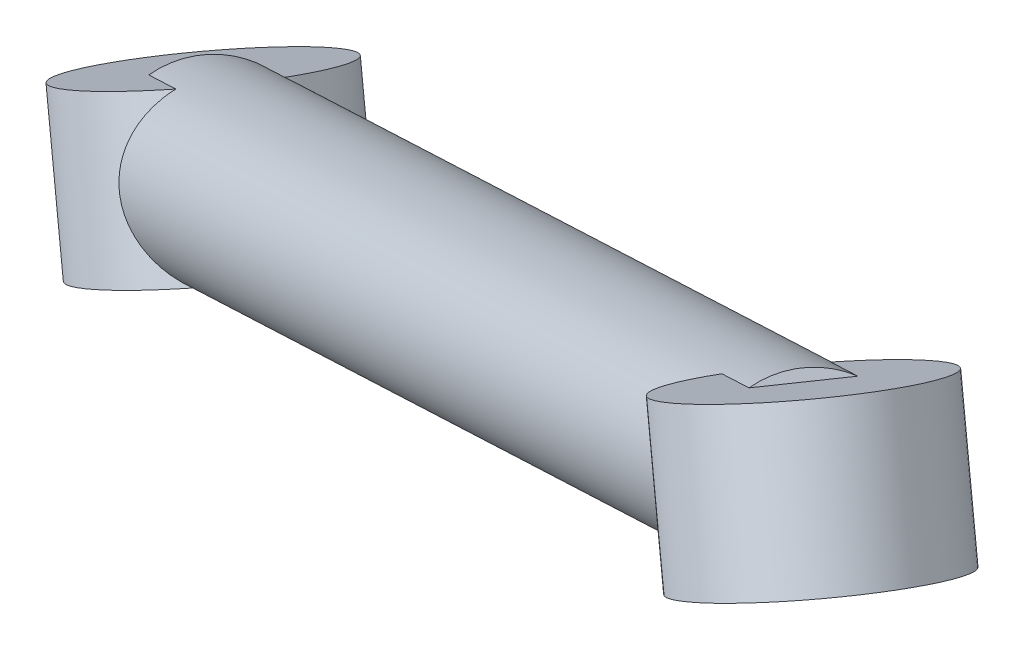
ISO-10303-21;
HEADER;
FILE_DESCRIPTION(('STEP AP214'),'2;1');
FILE_NAME('part.step','',(''),(''),'','','');
FILE_SCHEMA(('AUTOMOTIVE_DESIGN { 1 0 10303 214 1 1 1 1 }'));
ENDSEC;
DATA;
#1=APPLICATION_CONTEXT('core data for automotive mechanical design processes');
#2=APPLICATION_PROTOCOL_DEFINITION('international standard','automotive_design',2000,#1);
#3=PRODUCT_CONTEXT('',#1,'mechanical');
#4=PRODUCT('Part','Part','',(#3));
#5=PRODUCT_RELATED_PRODUCT_CATEGORY('part','',(#4));
#6=PRODUCT_DEFINITION_FORMATION('','',#4);
#7=PRODUCT_DEFINITION_CONTEXT('part definition',#1,'design');
#8=PRODUCT_DEFINITION('design','',#6,#7);
#9=PRODUCT_DEFINITION_SHAPE('','',#8);
#10=(LENGTH_UNIT() NAMED_UNIT(*) SI_UNIT(.MILLI.,.METRE.));
#11=(NAMED_UNIT(*) PLANE_ANGLE_UNIT() SI_UNIT($,.RADIAN.));
#12=(NAMED_UNIT(*) SI_UNIT($,.STERADIAN.) SOLID_ANGLE_UNIT());
#13=UNCERTAINTY_MEASURE_WITH_UNIT(LENGTH_MEASURE(1.E-05),#10,'distance_accuracy_value','');
#14=(GEOMETRIC_REPRESENTATION_CONTEXT(3) GLOBAL_UNCERTAINTY_ASSIGNED_CONTEXT((#13)) GLOBAL_UNIT_ASSIGNED_CONTEXT((#10,
#11,#12)) REPRESENTATION_CONTEXT('',''));
#15=CARTESIAN_POINT('',(0.,0.,0.));
#16=DIRECTION('',(0.,0.,1.));
#17=DIRECTION('',(1.,0.,0.));
#18=AXIS2_PLACEMENT_3D('',#15,#16,#17);
#19=CARTESIAN_POINT('',(-510.46,-91.3399999999999,-282.35));
#20=DIRECTION('',(0.73343010732889,0.486905775206921,0.474344857391413));
#21=DIRECTION('',(-0.553088880485254,0.833122254104143,0.));
#22=AXIS2_PLACEMENT_3D('',#19,#20,#21);
#23=CYLINDRICAL_SURFACE('',#22,8.00000000000003);
#24=CARTESIAN_POINT('',(-503.581405175729,-80.2676399121449,-282.646270580201));
#25=CARTESIAN_POINT('',(-503.476677199646,-80.4115363120821,-282.828175080798));
#26=CARTESIAN_POINT('',(-503.375826094304,-80.5653431792206,-283.004287175508));
#27=CARTESIAN_POINT('',(-503.181173613399,-80.8903905662672,-283.343558039957));
#28=CARTESIAN_POINT('',(-503.087366323826,-81.0616161703276,-283.506727682853));
#29=CARTESIAN_POINT('',(-502.905628953708,-81.4199441120333,-283.819563124503));
#30=CARTESIAN_POINT('',(-502.817718855189,-81.6070959906179,-283.96918355869));
#31=CARTESIAN_POINT('',(-502.646976643849,-81.9948487313955,-284.253192957032));
#32=CARTESIAN_POINT('',(-502.564145664256,-82.1954525741737,-284.387578527694));
#33=CARTESIAN_POINT('',(-502.402486491135,-82.6076796908098,-284.639439078509));
#34=CARTESIAN_POINT('',(-502.323647794297,-82.8192707264558,-284.756960103233));
#35=CARTESIAN_POINT('',(-502.168184001193,-83.2522973519696,-284.974014892292));
#36=CARTESIAN_POINT('',(-502.0915590823,-83.4737337270773,-285.073547218675));
#37=CARTESIAN_POINT('',(-501.93886870445,-83.924399361229,-285.252560766713));
#38=CARTESIAN_POINT('',(-501.862802583783,-84.1536165623884,-285.33207153807));
#39=CARTESIAN_POINT('',(-501.709232500023,-84.6179893751629,-285.46879417626));
#40=CARTESIAN_POINT('',(-501.631729224245,-84.8531421665885,-285.526016428368));
#41=CARTESIAN_POINT('',(-501.444485358783,-85.4127641634102,-285.631377618487));
#42=CARTESIAN_POINT('',(-501.333183173681,-85.7389134685434,-285.668831812061));
#43=CARTESIAN_POINT('',(-501.158109889239,-86.2260052832232,-285.684055610645));
#44=CARTESIAN_POINT('',(-501.098431099207,-86.3879323205382,-285.682315203744));
#45=CARTESIAN_POINT('',(-500.976012490465,-86.7097885562165,-285.664402217226));
#46=CARTESIAN_POINT('',(-500.91327424723,-86.869718730672,-285.64823699305));
#47=CARTESIAN_POINT('',(-500.784106338227,-87.1874278181539,-285.600712115287));
#48=CARTESIAN_POINT('',(-500.717649685585,-87.3451766250713,-285.569223665327));
#49=CARTESIAN_POINT('',(-500.581808686333,-87.6555185564321,-285.490869076787));
#50=CARTESIAN_POINT('',(-500.512424399164,-87.8081117854356,-285.44400325028));
#51=CARTESIAN_POINT('',(-500.371306279346,-88.1067854559784,-285.335263425766));
#52=CARTESIAN_POINT('',(-500.299571644758,-88.252863633583,-285.273384258095));
#53=CARTESIAN_POINT('',(-500.154639559846,-88.5374066150112,-285.135491697386));
#54=CARTESIAN_POINT('',(-500.081442096928,-88.6758713532521,-285.059478182617));
#55=CARTESIAN_POINT('',(-499.941904229745,-88.9312231620048,-284.902724495031));
#56=CARTESIAN_POINT('',(-499.875605451297,-89.0488869711024,-284.823205193333));
#57=CARTESIAN_POINT('',(-499.743397261955,-89.2774486835172,-284.654651254059));
#58=CARTESIAN_POINT('',(-499.677487999901,-89.3883441347021,-284.565613199672));
#59=CARTESIAN_POINT('',(-499.481404952629,-89.7110787760623,-284.285601896247));
#60=CARTESIAN_POINT('',(-499.352903521188,-89.9129168550255,-284.081762634473));
#61=CARTESIAN_POINT('',(-499.132145575385,-90.2515646150561,-283.693414972587));
#62=CARTESIAN_POINT('',(-499.03798112228,-90.3930882124752,-283.513972044894));
#63=CARTESIAN_POINT('',(-498.857931035137,-90.6623913453528,-283.141007828853));
#64=CARTESIAN_POINT('',(-498.772049172752,-90.7901646223523,-282.947480196464));
#65=CARTESIAN_POINT('',(-498.61045307661,-91.0333676777205,-282.548369060755));
#66=CARTESIAN_POINT('',(-498.534754610446,-91.1487782591243,-282.342767553901));
#67=CARTESIAN_POINT('',(-498.39547533516,-91.3681229876227,-281.921611686923));
#68=CARTESIAN_POINT('',(-498.331893390269,-91.4720582099989,-281.706058262017));
#69=CARTESIAN_POINT('',(-498.219643638824,-91.6673871468533,-281.270732507963));
#70=CARTESIAN_POINT('',(-498.170717109407,-91.7589804645991,-281.051116477132));
#71=CARTESIAN_POINT('',(-498.087821722427,-91.9323335654106,-280.605320139953));
#72=CARTESIAN_POINT('',(-498.053849704762,-92.0140954233462,-280.379141231211));
#73=CARTESIAN_POINT('',(-498.002542146742,-92.1678400778827,-279.922230677667));
#74=CARTESIAN_POINT('',(-497.985165172912,-92.239846842198,-279.691511847174));
#75=CARTESIAN_POINT('',(-497.968471548126,-92.3743289341864,-279.226489384899));
#76=CARTESIAN_POINT('',(-497.969168984882,-92.4367967888155,-278.992183099108));
#77=CARTESIAN_POINT('',(-497.979704526284,-92.4944425144162,-278.757022363282));
#78=B_SPLINE_CURVE_WITH_KNOTS('',3,(#24,#25,#26,#27,#28,#29,#30,#31,#32,#33,#34,#35,#36,#37,#38,
#39,#40,#41,#42,#43,#44,#45,#46,#47,#48,#49,#50,#51,#52,#53,#54,#55,#56,#57,#58,#59,#60,#61,#62,
#63,#64,#65,#66,#67,#68,#69,#70,#71,#72,#73,#74,#75,#76,#77),.UNSPECIFIED.,.F.,.F.,(4,2,2,2,2,2,
2,2,2,2,2,2,2,2,2,2,2,2,2,2,2,2,2,2,2,2,4),(0.,0.762982175315845,1.52531641437073,
2.29011533983666,3.05508428723432,3.81792322674232,4.58082311791998,5.34259036141124,
6.10400223574005,7.13950341822891,7.65672989610423,8.17369278275145,8.69507797951773,
9.21645259574195,9.7380069964463,10.259565889148,10.729281816926,11.1991669217808,
12.1391291356849,12.8797876567711,13.6207818754046,14.3629105313426,15.1049695880797,
15.8330299552625,16.5609363990316,17.2870206628004,18.0136708743372),.UNSPECIFIED.);
#79=CARTESIAN_POINT('',(-503.581405175729,-80.2676399121449,-282.646270580201));
#80=VERTEX_POINT('',#79);
#81=CARTESIAN_POINT('',(-497.979704526284,-92.4944425144163,-278.757022363282));
#82=VERTEX_POINT('',#81);
#83=EDGE_CURVE('E234',#80,#82,#78,.T.);
#84=ORIENTED_EDGE('',*,*,#83,.F.);
#85=CARTESIAN_POINT('',(-503.179536162434,-80.0008456001787,-282.386358172645));
#86=CARTESIAN_POINT('',(-504.985091392909,-81.1995243971409,-283.554117296346));
#87=CARTESIAN_POINT('',(-506.790646623384,-82.3982031941031,-284.721876420048));
#88=CARTESIAN_POINT('',(-510.401757084334,-84.7955607880275,-287.057394667451));
#89=CARTESIAN_POINT('',(-512.207312314809,-85.9942395849896,-288.225153791152));
#90=CARTESIAN_POINT('',(-514.012867545284,-87.1929183819518,-289.392912914853));
#91=B_SPLINE_CURVE_WITH_KNOTS('',3,(#85,#86,#87,#88,#89,#90),.UNSPECIFIED.,.F.,.F.,(4,2,4),(0.,
7.38543819120678,14.7708763824135),.UNSPECIFIED.);
#92=CARTESIAN_POINT('',(-511.132478701389,-85.2806750034608,-287.529995461629));
#93=VERTEX_POINT('',#92);
#94=EDGE_CURVE('E145',#80,#93,#91,.T.);
#95=ORIENTED_EDGE('',*,*,#94,.T.);
#96=CARTESIAN_POINT('',(-510.46,-91.3399999999999,-282.35));
#97=DIRECTION('',(0.73343010732889,0.486905775206922,0.474344857391413));
#98=DIRECTION('',(-0.553088880485254,0.833122254104143,0.));
#99=AXIS2_PLACEMENT_3D('',#96,#97,#98);
#100=CIRCLE('',#99,8.00000000000003);
#101=CARTESIAN_POINT('',(-515.389148345821,-85.1725242643061,-281.059364639211));
#102=VERTEX_POINT('',#101);
#103=EDGE_CURVE('E208',#93,#102,#100,.T.);
#104=ORIENTED_EDGE('',*,*,#103,.T.);
#105=CARTESIAN_POINT('',(-515.898318955159,-85.5105509424443,-281.388664567178));
#106=CARTESIAN_POINT('',(-514.481806971051,-84.5701611561515,-280.472552588825));
#107=CARTESIAN_POINT('',(-513.065294986942,-83.6297713698586,-279.556440610471));
#108=CARTESIAN_POINT('',(-510.232271018724,-81.748991797273,-277.724216653763));
#109=CARTESIAN_POINT('',(-508.815759034615,-80.8086020109801,-276.808104675409));
#110=CARTESIAN_POINT('',(-507.399247050507,-79.8682122246873,-275.891992697055));
#111=B_SPLINE_CURVE_WITH_KNOTS('',3,(#105,#106,#107,#108,#109,#110),.UNSPECIFIED.,.F.,.F.,(4,2,
4),(0.,5.794040280628,11.5880805612561),.UNSPECIFIED.);
#112=CARTESIAN_POINT('',(-507.838001217095,-80.1594910430497,-276.175751642969));
#113=VERTEX_POINT('',#112);
#114=EDGE_CURVE('E240',#102,#113,#111,.T.);
#115=ORIENTED_EDGE('',*,*,#114,.T.);
#116=CARTESIAN_POINT('',(-502.23644777212,-92.3862899052442,-272.286279658207));
#117=CARTESIAN_POINT('',(-502.45785165352,-92.3198470600164,-272.179836852182));
#118=CARTESIAN_POINT('',(-502.682597254436,-92.2482861564152,-272.083855335997));
#119=CARTESIAN_POINT('',(-503.136061247345,-92.0950485517274,-271.911974885147));
#120=CARTESIAN_POINT('',(-503.364776103732,-92.0133804922048,-271.836058966302));
#121=CARTESIAN_POINT('',(-503.824594968542,-91.8396553547438,-271.703077333355));
#122=CARTESIAN_POINT('',(-504.055704311868,-91.7475655278904,-271.646073384562));
#123=CARTESIAN_POINT('',(-504.517315142001,-91.5529046519309,-271.550188432395));
#124=CARTESIAN_POINT('',(-504.747816482261,-91.4503312774226,-271.511311460529));
#125=CARTESIAN_POINT('',(-505.20522621156,-91.2344372018308,-271.450733523675));
#126=CARTESIAN_POINT('',(-505.43214281712,-91.1211472176917,-271.428985039942));
#127=CARTESIAN_POINT('',(-505.880658964829,-90.882662423278,-271.40146863843));
#128=CARTESIAN_POINT('',(-506.102258080585,-90.7574666622872,-271.395701997964));
#129=CARTESIAN_POINT('',(-506.537112144204,-90.4941143878635,-271.399185701587));
#130=CARTESIAN_POINT('',(-506.750378996533,-90.3559774007949,-271.408413754164));
#131=CARTESIAN_POINT('',(-507.165528460853,-90.0652528672279,-271.440876746486));
#132=CARTESIAN_POINT('',(-507.367416337994,-89.9126720930391,-271.464105148989));
#133=CARTESIAN_POINT('',(-507.826210313181,-89.5333267657431,-271.534384890679));
#134=CARTESIAN_POINT('',(-508.076763680189,-89.2996283969995,-271.587001663371));
#135=CARTESIAN_POINT('',(-508.421956463312,-88.9254840637553,-271.681817496639));
#136=CARTESIAN_POINT('',(-508.531866548986,-88.7969076332542,-271.716049848365));
#137=CARTESIAN_POINT('',(-508.739985727047,-88.5319528659898,-271.789399160753));
#138=CARTESIAN_POINT('',(-508.8382007538,-88.3955785385259,-271.828513623291));
#139=CARTESIAN_POINT('',(-509.02224203777,-88.1143065634057,-271.911536881457));
#140=CARTESIAN_POINT('',(-509.107955144766,-87.9693459902139,-271.955483822894));
#141=CARTESIAN_POINT('',(-509.264777526166,-87.6729421307664,-272.047416472278));
#142=CARTESIAN_POINT('',(-509.335887096764,-87.5214989760679,-272.095402098283));
#143=CARTESIAN_POINT('',(-509.462834275511,-87.2134271732414,-272.194984333438));
#144=CARTESIAN_POINT('',(-509.518666605979,-87.0567967540143,-272.246582182759));
#145=CARTESIAN_POINT('',(-509.614948705156,-86.7399661538923,-272.353016836927));
#146=CARTESIAN_POINT('',(-509.655398341187,-86.5797659422199,-272.407853669707));
#147=CARTESIAN_POINT('',(-509.718119140487,-86.2734235814709,-272.514931652423));
#148=CARTESIAN_POINT('',(-509.741797418315,-86.1274666007995,-272.56688914376));
#149=CARTESIAN_POINT('',(-509.777730526239,-85.8349934386122,-272.67318310902));
#150=CARTESIAN_POINT('',(-509.789981238872,-85.6884770746225,-272.727520433042));
#151=CARTESIAN_POINT('',(-509.810776819378,-85.249378593867,-272.894173279794));
#152=CARTESIAN_POINT('',(-509.80335360282,-84.9573071608972,-273.010108954459));
#153=CARTESIAN_POINT('',(-509.758262927557,-84.442174282641,-273.226529769961));
#154=CARTESIAN_POINT('',(-509.727341818892,-84.2176111248524,-273.325078860392));
#155=CARTESIAN_POINT('',(-509.6465155583,-83.7751223276322,-273.529332002633));
#156=CARTESIAN_POINT('',(-509.596601808392,-83.5571997427232,-273.635039277115));
#157=CARTESIAN_POINT('',(-509.480341064703,-83.1295389336508,-273.854457615876));
#158=CARTESIAN_POINT('',(-509.413969032091,-82.9198137486595,-273.968180684546));
#159=CARTESIAN_POINT('',(-509.267022146621,-82.5104559903328,-274.204231323387));
#160=CARTESIAN_POINT('',(-509.186448626421,-82.3108224722609,-274.326558085544));
#161=CARTESIAN_POINT('',(-509.014540935373,-81.9268565036553,-274.578114622362));
#162=CARTESIAN_POINT('',(-508.923438605297,-81.7423063523284,-274.707170498541));
#163=CARTESIAN_POINT('',(-508.730777912219,-81.386028195975,-274.974757730262));
#164=CARTESIAN_POINT('',(-508.629221764066,-81.2142974881429,-275.113287076584));
#165=CARTESIAN_POINT('',(-508.417219193927,-80.8857576973748,-275.399908212494));
#166=CARTESIAN_POINT('',(-508.306795657852,-80.7289123455357,-275.547975202337));
#167=CARTESIAN_POINT('',(-508.078016678877,-80.4314772383375,-275.854244228098));
#168=CARTESIAN_POINT('',(-507.959655120081,-80.2909002496656,-276.012454074404));
#169=CARTESIAN_POINT('',(-507.838001217095,-80.1594910430498,-276.175751642968));
#170=B_SPLINE_CURVE_WITH_KNOTS('',3,(#116,#117,#118,#119,#120,#121,#122,#123,#124,#125,#126,
#127,#128,#129,#130,#131,#132,#133,#134,#135,#136,#137,#138,#139,#140,#141,#142,#143,#144,#145,
#146,#147,#148,#149,#150,#151,#152,#153,#154,#155,#156,#157,#158,#159,#160,#161,#162,#163,#164,
#165,#166,#167,#168,#169),.UNSPECIFIED.,.F.,.F.,(4,2,2,2,2,2,2,2,2,2,2,2,2,2,2,2,2,2,2,2,2,2,2,
2,2,2,4),(0.,0.762988254942131,1.52532860832675,2.29013475509881,3.05511091661941,
3.81795729148064,4.58086463341733,5.34263885412005,6.10405765165912,7.13954188038973,
7.65675990399541,8.17371434952899,8.69509046337575,9.21645600145795,9.7380014239373,
10.2595513447314,10.7292678807949,11.1991535950393,12.139117010572,12.8797816748248,
13.6207820381881,14.3629167152052,15.1049817877569,15.8330388812544,16.5609420376944,
17.2870234611222,18.0136708715011),.UNSPECIFIED.);
#171=CARTESIAN_POINT('',(-502.23644777212,-92.3862899052442,-272.286279658207));
#172=VERTEX_POINT('',#171);
#173=EDGE_CURVE('E132',#172,#113,#170,.T.);
#174=ORIENTED_EDGE('',*,*,#173,.F.);
#175=CARTESIAN_POINT('',(-511.186126099011,-98.3278360114482,-278.074564802387));
#176=CARTESIAN_POINT('',(-509.621382400846,-97.2890280803214,-277.062552708586));
#177=CARTESIAN_POINT('',(-508.056638702681,-96.2502201491946,-276.050540614785));
#178=CARTESIAN_POINT('',(-504.927151306351,-94.172604286941,-274.026516427184));
#179=CARTESIAN_POINT('',(-503.362407608186,-93.1337963558141,-273.014504333383));
#180=CARTESIAN_POINT('',(-501.797663910021,-92.0949884246873,-272.002492239582));
#181=B_SPLINE_CURVE_WITH_KNOTS('',3,(#175,#176,#177,#178,#179,#180),.UNSPECIFIED.,.F.,.F.,(4,2,
4),(0.,6.40042335556506,12.8008467111301),.UNSPECIFIED.);
#182=CARTESIAN_POINT('',(-509.787521298611,-97.3993249965391,-277.170004538371));
#183=VERTEX_POINT('',#182);
#184=EDGE_CURVE('E219',#183,#172,#181,.T.);
#185=ORIENTED_EDGE('',*,*,#184,.F.);
#186=CARTESIAN_POINT('',(-505.530851654179,-97.5074757356939,-283.640635360788));
#187=VERTEX_POINT('',#186);
#188=EDGE_CURVE('E210',#183,#187,#100,.T.);
#189=ORIENTED_EDGE('',*,*,#188,.T.);
#190=CARTESIAN_POINT('',(-497.577872162434,-92.2276752331851,-278.497142146136));
#191=CARTESIAN_POINT('',(-499.109320605838,-93.244368696229,-279.487587888538));
#192=CARTESIAN_POINT('',(-500.640769049243,-94.2610621592728,-280.478033630939));
#193=CARTESIAN_POINT('',(-503.703665936053,-96.2944490853606,-282.458925115742));
#194=CARTESIAN_POINT('',(-505.235114379458,-97.3111425484044,-283.449370858143));
#195=CARTESIAN_POINT('',(-506.766562822862,-98.3278360114483,-284.439816600544));
#196=B_SPLINE_CURVE_WITH_KNOTS('',3,(#190,#191,#192,#193,#194,#195),.UNSPECIFIED.,.F.,.F.,(4,2,
4),(0.,6.26417147843164,12.5283429568633),.UNSPECIFIED.);
#197=EDGE_CURVE('E148',#82,#187,#196,.T.);
#198=ORIENTED_EDGE('',*,*,#197,.F.);
#199=EDGE_LOOP('',(#84,#95,#104,#115,#174,#185,#189,#198));
#200=FACE_BOUND('',#199,.T.);
#201=CARTESIAN_POINT('',(-355.536595473716,20.9495425144163,-177.674877636718));
#202=CARTESIAN_POINT('',(-355.5476598468,20.8890060738787,-177.427941773889));
#203=CARTESIAN_POINT('',(-355.54787472409,20.8231608221911,-177.181957310636));
#204=CARTESIAN_POINT('',(-355.528448338031,20.680950967346,-176.694050333385));
#205=CARTESIAN_POINT('',(-355.508823935632,20.6045953443144,-176.452124547504));
#206=CARTESIAN_POINT('',(-355.451481803249,20.4410960781896,-175.973294936523));
#207=CARTESIAN_POINT('',(-355.413705755626,20.3539183400299,-175.736409886011));
#208=CARTESIAN_POINT('',(-355.32191634427,20.1686536500884,-175.270123452795));
#209=CARTESIAN_POINT('',(-355.267899372884,20.07056427752,-175.040723745401));
#210=CARTESIAN_POINT('',(-355.145683765838,19.8631865997485,-174.591767797758));
#211=CARTESIAN_POINT('',(-355.07752503236,19.7539302340592,-174.372185930254));
#212=CARTESIAN_POINT('',(-354.928824003506,19.523062950381,-173.943948629661));
#213=CARTESIAN_POINT('',(-354.848280718866,19.4014510457078,-173.735294071222));
#214=CARTESIAN_POINT('',(-354.676910276592,19.1447931945736,-173.331284749242));
#215=CARTESIAN_POINT('',(-354.586098570937,19.0097674695321,-173.135910692248));
#216=CARTESIAN_POINT('',(-354.396345476108,18.7247696627256,-172.760819115255));
#217=CARTESIAN_POINT('',(-354.297407899792,18.5748045839185,-172.581094332872));
#218=CARTESIAN_POINT('',(-354.057010405438,18.2010081346901,-172.178826647923));
#219=CARTESIAN_POINT('',(-353.913063045027,17.9700183431617,-171.964156399213));
#220=CARTESIAN_POINT('',(-353.695047835092,17.5991052563363,-171.676015926326));
#221=CARTESIAN_POINT('',(-353.622064595143,17.4714670395077,-171.585650492617));
#222=CARTESIAN_POINT('',(-353.476367114584,17.2080982427996,-171.417412971));
#223=CARTESIAN_POINT('',(-353.403652755844,17.0723718199948,-171.339534539861));
#224=CARTESIAN_POINT('',(-353.258859368239,16.7920970303168,-171.19684993394));
#225=CARTESIAN_POINT('',(-353.186791093253,16.6474831362875,-171.132161267645));
#226=CARTESIAN_POINT('',(-353.044829474715,16.3514568495958,-171.017638537694));
#227=CARTESIAN_POINT('',(-352.974936087075,16.2000445948958,-170.967804172749));
#228=CARTESIAN_POINT('',(-352.837961686022,15.8917180268199,-170.883464476746));
#229=CARTESIAN_POINT('',(-352.77088165127,15.7348018331179,-170.848964440528));
#230=CARTESIAN_POINT('',(-352.639894524848,15.4170894698659,-170.795285446944));
#231=CARTESIAN_POINT('',(-352.57598746055,15.2562932668629,-170.776106621725));
#232=CARTESIAN_POINT('',(-352.457539868354,14.9485350354108,-170.753739817903));
#233=CARTESIAN_POINT('',(-352.402699676018,14.8017863127511,-170.749152045465));
#234=CARTESIAN_POINT('',(-352.295367677288,14.5074990932231,-170.751392662903));
#235=CARTESIAN_POINT('',(-352.242876723827,14.3599603309378,-170.758225165141));
#236=CARTESIAN_POINT('',(-352.08837342263,13.9174646899535,-170.794823538466));
#237=CARTESIAN_POINT('',(-351.989353303032,13.6226888127948,-170.840694061911));
#238=CARTESIAN_POINT('',(-351.81641687645,13.1020164414161,-170.955699690828));
#239=CARTESIAN_POINT('',(-351.741629397566,12.8747675074612,-171.017839895532));
#240=CARTESIAN_POINT('',(-351.592901697002,12.4264463500514,-171.162535358783));
#241=CARTESIAN_POINT('',(-351.518961874695,12.2053769728139,-171.245099857491));
#242=CARTESIAN_POINT('',(-351.370116250009,11.7709805107335,-171.428673900503));
#243=CARTESIAN_POINT('',(-351.295209142183,11.5576657957243,-171.529711486767));
#244=CARTESIAN_POINT('',(-351.142964838933,11.1407063790798,-171.748466103971));
#245=CARTESIAN_POINT('',(-351.065627872084,10.9370607723749,-171.866181569665));
#246=CARTESIAN_POINT('',(-350.908642894613,10.5447385092541,-172.114579977898));
#247=CARTESIAN_POINT('',(-350.829066068024,10.3558518511053,-172.244976186124));
#248=CARTESIAN_POINT('',(-350.665156963811,9.99051419745502,-172.519416340463));
#249=CARTESIAN_POINT('',(-350.580825695215,9.8140605810582,-172.663457395131));
#250=CARTESIAN_POINT('',(-350.406675566718,9.47570966956128,-172.96383308131));
#251=CARTESIAN_POINT('',(-350.316870968899,9.3137770493906,-173.120136043308));
#252=CARTESIAN_POINT('',(-350.13084846082,9.00580293137533,-173.444413315833));
#253=CARTESIAN_POINT('',(-350.034625605892,8.85977391919822,-173.612396629305));
#254=CARTESIAN_POINT('',(-349.934894824271,8.72273991214491,-173.785629419799));
#255=B_SPLINE_CURVE_WITH_KNOTS('',3,(#201,#202,#203,#204,#205,#206,#207,#208,#209,#210,#211,
#212,#213,#214,#215,#216,#217,#218,#219,#220,#221,#222,#223,#224,#225,#226,#227,#228,#229,#230,
#231,#232,#233,#234,#235,#236,#237,#238,#239,#240,#241,#242,#243,#244,#245,#246,#247,#248,#249,
#250,#251,#252,#253,#254),.UNSPECIFIED.,.F.,.F.,(4,2,2,2,2,2,2,2,2,2,2,2,2,2,2,2,2,2,2,2,2,2,2,
2,2,2,4),(0.,0.762988254942144,1.52532860832666,2.2901347550987,3.05511091661945,
3.81795729148071,4.58086463341737,5.34263885412012,6.10405765165906,7.13954188038964,
7.65675990399536,8.17371434952899,8.69509046337578,9.21645600145797,9.73800142393734,
10.2595513447315,10.7292678807949,11.1991535950394,12.1391170105722,12.8797816748249,
13.6207820381882,14.3629167152052,15.1049817877569,15.8330388812544,16.5609420376945,
17.2870234611223,18.0136708715013),.UNSPECIFIED.);
#256=CARTESIAN_POINT('',(-355.536595473716,20.9495425144163,-177.674877636718));
#257=VERTEX_POINT('',#256);
#258=CARTESIAN_POINT('',(-349.934894824271,8.7227399121449,-173.785629419799));
#259=VERTEX_POINT('',#258);
#260=EDGE_CURVE('E12',#257,#259,#255,.T.);
#261=ORIENTED_EDGE('',*,*,#260,.F.);
#262=CARTESIAN_POINT('',(-355.938427837566,20.682775233185,-177.934757853862));
#263=CARTESIAN_POINT('',(-354.406979394161,21.6994686962289,-176.944312111461));
#264=CARTESIAN_POINT('',(-352.875530950757,22.7161621592728,-175.95386636906));
#265=CARTESIAN_POINT('',(-349.812634063947,24.7495490853606,-173.972974884258));
#266=CARTESIAN_POINT('',(-348.281185620542,25.7662425484045,-172.982529141856));
#267=CARTESIAN_POINT('',(-346.749737177137,26.7829360114484,-171.992083399455));
#268=B_SPLINE_CURVE_WITH_KNOTS('',3,(#262,#263,#264,#265,#266,#267),.UNSPECIFIED.,.F.,.F.,(4,2,
4),(0.,6.26417147843156,12.5283429568631),.UNSPECIFIED.);
#269=CARTESIAN_POINT('',(-347.985448345821,25.9625757356939,-172.791264639211));
#270=VERTEX_POINT('',#269);
#271=EDGE_CURVE('E141',#257,#270,#268,.T.);
#272=ORIENTED_EDGE('',*,*,#271,.T.);
#273=CARTESIAN_POINT('',(-343.0563,19.7951000000001,-174.0819));
#274=DIRECTION('',(0.73343010732889,0.486905775206922,0.474344857391413));
#275=DIRECTION('',(-0.553088880485254,0.833122254104143,0.));
#276=AXIS2_PLACEMENT_3D('',#273,#274,#275);
#277=CIRCLE('',#276,8.00000000000003);
#278=CARTESIAN_POINT('',(-343.728778701389,25.8544249965392,-179.261895461629));
#279=VERTEX_POINT('',#278);
#280=EDGE_CURVE('E133',#279,#270,#277,.T.);
#281=ORIENTED_EDGE('',*,*,#280,.F.);
#282=CARTESIAN_POINT('',(-342.330173900989,26.7829360114484,-178.357335197613));
#283=CARTESIAN_POINT('',(-343.894917599154,25.7441280803215,-179.369347291414));
#284=CARTESIAN_POINT('',(-345.459661297319,24.7053201491946,-180.381359385215));
#285=CARTESIAN_POINT('',(-348.589148693648,22.6277042869408,-182.405383572816));
#286=CARTESIAN_POINT('',(-350.153892391813,21.5888963558139,-183.417395666617));
#287=CARTESIAN_POINT('',(-351.718636089978,20.550088424687,-184.429407760418));
#288=B_SPLINE_CURVE_WITH_KNOTS('',3,(#282,#283,#284,#285,#286,#287),.UNSPECIFIED.,.F.,.F.,(4,2,
4),(0.,6.40042335556528,12.8008467111305),.UNSPECIFIED.);
#289=CARTESIAN_POINT('',(-351.27985222788,20.8413899052442,-184.145620341793));
#290=VERTEX_POINT('',#289);
#291=EDGE_CURVE('E191',#279,#290,#288,.T.);
#292=ORIENTED_EDGE('',*,*,#291,.T.);
#293=CARTESIAN_POINT('',(-345.678298782905,8.61459104304979,-180.256148357031));
#294=CARTESIAN_POINT('',(-345.550556994578,8.75258099993365,-180.427624820551));
#295=CARTESIAN_POINT('',(-345.426445860226,8.90067217040375,-180.593481382945));
#296=CARTESIAN_POINT('',(-345.187056787243,9.21469170732393,-180.914003946552));
#297=CARTESIAN_POINT('',(-345.071771436831,9.38060481935292,-181.068679331352));
#298=CARTESIAN_POINT('',(-344.851027609172,9.72870677626979,-181.367661921477));
#299=CARTESIAN_POINT('',(-344.745602108032,9.91094650762309,-181.511933988875));
#300=CARTESIAN_POINT('',(-344.546517899344,10.2893029353141,-181.790103578399));
#301=CARTESIAN_POINT('',(-344.452861812873,10.485422707624,-181.923998787037));
#302=CARTESIAN_POINT('',(-344.27932114187,10.8891332810621,-182.181680818624));
#303=CARTESIAN_POINT('',(-344.199398937582,11.0966906212984,-182.305494749637));
#304=CARTESIAN_POINT('',(-344.055041125624,11.5220995712793,-182.544203522468));
#305=CARTESIAN_POINT('',(-343.990606755861,11.7399520022224,-182.659097650851));
#306=CARTESIAN_POINT('',(-343.879806017229,12.183923022653,-182.880621114645));
#307=CARTESIAN_POINT('',(-343.833412965533,12.4100288595033,-182.987262467218));
#308=CARTESIAN_POINT('',(-343.761578033596,12.86867472584,-183.193181556936));
#309=CARTESIAN_POINT('',(-343.736126389601,13.1012117045286,-183.292462706043));
#310=CARTESIAN_POINT('',(-343.704958794569,13.6552844426891,-183.519112230001));
#311=CARTESIAN_POINT('',(-343.709645277988,13.9787249242805,-183.643726250098));
#312=CARTESIAN_POINT('',(-343.757526987468,14.4625851367935,-183.821848375453));
#313=CARTESIAN_POINT('',(-343.78027435712,14.6235738442061,-183.879728818343));
#314=CARTESIAN_POINT('',(-343.840262340308,14.9438438824898,-183.992543585762));
#315=CARTESIAN_POINT('',(-343.877495561825,15.1031260416701,-184.047479396674));
#316=CARTESIAN_POINT('',(-343.967407091558,15.4198377281815,-184.15467851719));
#317=CARTESIAN_POINT('',(-344.020214798661,15.5772397514224,-184.206914945049));
#318=CARTESIAN_POINT('',(-344.141187200041,15.8872039109605,-184.307871524279));
#319=CARTESIAN_POINT('',(-344.209351582655,16.0397661454095,-184.356591746986));
#320=CARTESIAN_POINT('',(-344.360489941035,16.3386944037633,-184.450099648447));
#321=CARTESIAN_POINT('',(-344.443469015455,16.4850582729016,-184.494885965359));
#322=CARTESIAN_POINT('',(-344.623100099035,16.7704828642896,-184.580032029619));
#323=CARTESIAN_POINT('',(-344.71975222595,16.9095435236284,-184.620391738839));
#324=CARTESIAN_POINT('',(-344.915011626475,17.1663110694528,-184.692442242661));
#325=CARTESIAN_POINT('',(-345.012469600249,17.2847665514513,-184.724595958933));
#326=CARTESIAN_POINT('',(-345.216071311431,17.5151421847957,-184.784623476958));
#327=CARTESIAN_POINT('',(-345.32221816454,17.6270599669523,-184.812495733048));
#328=CARTESIAN_POINT('',(-345.652001088898,17.9531915692561,-184.889267739582));
#329=CARTESIAN_POINT('',(-345.8869407685,18.1577339631355,-184.931308537588));
#330=CARTESIAN_POINT('',(-346.32571622333,18.5019209725605,-184.98824433725));
#331=CARTESIAN_POINT('',(-346.525584586303,18.6461302272983,-185.007005080423));
#332=CARTESIAN_POINT('',(-346.93517909987,18.9212654781132,-185.031035184869));
#333=CARTESIAN_POINT('',(-347.144909677368,19.052185424035,-185.036298427426));
#334=CARTESIAN_POINT('',(-347.571602240489,19.3021238808429,-185.032432232633));
#335=CARTESIAN_POINT('',(-347.788574805576,19.4211238641732,-185.023280748236));
#336=CARTESIAN_POINT('',(-348.227034973305,19.6480699893881,-184.989647010707));
#337=CARTESIAN_POINT('',(-348.448522150603,19.7560171668907,-184.965166195423));
#338=CARTESIAN_POINT('',(-348.889656005576,19.9597021806464,-184.900550024204));
#339=CARTESIAN_POINT('',(-349.109258581833,20.0556319262017,-184.860718697926));
#340=CARTESIAN_POINT('',(-349.548717751324,20.2380443714903,-184.764496792207));
#341=CARTESIAN_POINT('',(-349.76857428104,20.32452906419,-184.708109715435));
#342=CARTESIAN_POINT('',(-350.206028854766,20.4880846950671,-184.578032085603));
#343=CARTESIAN_POINT('',(-350.423631174729,20.5651786568844,-184.504385201972));
#344=CARTESIAN_POINT('',(-350.855120978155,20.710199624817,-184.338869435368));
#345=CARTESIAN_POINT('',(-351.069005433877,20.778119438893,-184.246986393966));
#346=CARTESIAN_POINT('',(-351.27985222788,20.8413899052442,-184.145620341793));
#347=B_SPLINE_CURVE_WITH_KNOTS('',3,(#293,#294,#295,#296,#297,#298,#299,#300,#301,#302,#303,
#304,#305,#306,#307,#308,#309,#310,#311,#312,#313,#314,#315,#316,#317,#318,#319,#320,#321,#322,
#323,#324,#325,#326,#327,#328,#329,#330,#331,#332,#333,#334,#335,#336,#337,#338,#339,#340,#341,
#342,#343,#344,#345,#346),.UNSPECIFIED.,.F.,.F.,(4,2,2,2,2,2,2,2,2,2,2,2,2,2,2,2,2,2,2,2,2,2,2,
2,2,2,4),(0.,0.762982175315769,1.52531641437075,2.29011533983663,3.05508428723438,
3.81792322674241,4.58082311792008,5.34259036141136,6.10400223574017,7.13950341822902,
7.65672989610435,8.17369278275156,8.69507797951785,9.216452595742,9.73800699644632,
10.2595658891481,10.729281816926,11.1991669217809,12.1391291356849,12.8797876567711,
13.6207818754047,14.3629105313427,15.1049695880797,15.8330299552625,16.5609363990317,
17.2870206628005,18.0136708743374),.UNSPECIFIED.);
#348=CARTESIAN_POINT('',(-345.678298782905,8.61459104304979,-180.256148357031));
#349=VERTEX_POINT('',#348);
#350=EDGE_CURVE('E75',#349,#290,#347,.T.);
#351=ORIENTED_EDGE('',*,*,#350,.F.);
#352=CARTESIAN_POINT('',(-337.61798104484,13.9656509424446,-175.043235432821));
#353=CARTESIAN_POINT('',(-339.034493028949,13.0252611561516,-175.959347411175));
#354=CARTESIAN_POINT('',(-340.451005013058,12.0848713698587,-176.875459389529));
#355=CARTESIAN_POINT('',(-343.284028981276,10.2040917972728,-178.707683346237));
#356=CARTESIAN_POINT('',(-344.700540965385,9.26370201097989,-179.623795324591));
#357=CARTESIAN_POINT('',(-346.117052949494,8.32331222468695,-180.539907302944));
#358=B_SPLINE_CURVE_WITH_KNOTS('',3,(#352,#353,#354,#355,#356,#357),.UNSPECIFIED.,.F.,.F.,(4,2,
4),(0.,5.79404028062837,11.5880805612567),.UNSPECIFIED.);
#359=CARTESIAN_POINT('',(-338.127151654179,13.6276242643062,-175.372535360789));
#360=VERTEX_POINT('',#359);
#361=EDGE_CURVE('E136',#360,#349,#358,.T.);
#362=ORIENTED_EDGE('',*,*,#361,.F.);
#363=CARTESIAN_POINT('',(-342.383821298611,13.7357750034608,-168.901904538371));
#364=VERTEX_POINT('',#363);
#365=EDGE_CURVE('E127',#364,#360,#277,.T.);
#366=ORIENTED_EDGE('',*,*,#365,.F.);
#367=CARTESIAN_POINT('',(-350.336763837566,8.45594560017801,-174.045541827356));
#368=CARTESIAN_POINT('',(-348.531208607091,9.65462439714033,-172.877782703654));
#369=CARTESIAN_POINT('',(-346.725653376616,10.8533031941026,-171.710023579953));
#370=CARTESIAN_POINT('',(-343.114542915666,13.2506607880273,-169.37450533255));
#371=CARTESIAN_POINT('',(-341.308987685191,14.4493395849896,-168.206746208848));
#372=CARTESIAN_POINT('',(-339.503432454716,15.6480183819519,-167.038987085146));
#373=B_SPLINE_CURVE_WITH_KNOTS('',3,(#367,#368,#369,#370,#371,#372),.UNSPECIFIED.,.F.,.F.,(4,2,
4),(0.,7.38543819120714,14.7708763824143),.UNSPECIFIED.);
#374=EDGE_CURVE('E82',#259,#364,#373,.T.);
#375=ORIENTED_EDGE('',*,*,#374,.F.);
#376=EDGE_LOOP('',(#261,#272,#281,#292,#351,#362,#366,#375));
#377=FACE_BOUND('',#376,.T.);
#378=ADVANCED_FACE('F61',(#200,#377),#23,.T.);
#379=CARTESIAN_POINT('',(-343.0563,19.7951000000001,-174.0819));
#380=DIRECTION('',(0.73343010732889,0.486905775206922,0.474344857391413));
#381=DIRECTION('',(-0.553088880485254,0.833122254104143,0.));
#382=AXIS2_PLACEMENT_3D('',#379,#380,#381);
#383=PLANE('',#382);
#384=ORIENTED_EDGE('',*,*,#280,.T.);
#385=DIRECTION('',(0.549533705122578,-0.0139622008198678,-0.835354873022548));
#386=VECTOR('',#385,1.);
#387=CARTESIAN_POINT('',(-345.857113523605,25.9085003661166,-176.02658005042));
#388=LINE('',#387,#386);
#389=EDGE_CURVE('E144',#270,#279,#388,.T.);
#390=ORIENTED_EDGE('',*,*,#389,.T.);
#391=EDGE_LOOP('',(#384,#390));
#392=FACE_BOUND('',#391,.T.);
#393=ADVANCED_FACE('F265',(#392),#383,.T.);
#394=CARTESIAN_POINT('',(-510.46,-91.3399999999999,-282.35));
#395=DIRECTION('',(0.73343010732889,0.486905775206922,0.474344857391413));
#396=DIRECTION('',(-0.553088880485254,0.833122254104143,0.));
#397=AXIS2_PLACEMENT_3D('',#394,#395,#396);
#398=PLANE('',#397);
#399=DIRECTION('',(0.549533705122586,-0.0139622008198848,-0.835354873022543));
#400=VECTOR('',#399,1.);
#401=CARTESIAN_POINT('',(-513.260813523605,-85.2265996338835,-284.29468005042));
#402=LINE('',#401,#400);
#403=EDGE_CURVE('E205',#102,#93,#402,.T.);
#404=ORIENTED_EDGE('',*,*,#403,.F.);
#405=ORIENTED_EDGE('',*,*,#103,.F.);
#406=EDGE_LOOP('',(#404,#405));
#407=FACE_BOUND('',#406,.T.);
#408=ADVANCED_FACE('F263',(#407),#398,.F.);
#409=ORIENTED_EDGE('',*,*,#188,.F.);
#410=DIRECTION('',(0.549533705122586,-0.0139622008198848,-0.835354873022543));
#411=VECTOR('',#410,1.);
#412=CARTESIAN_POINT('',(-507.659186476395,-97.4534003661165,-280.40531994958));
#413=LINE('',#412,#411);
#414=EDGE_CURVE('E203',#183,#187,#413,.T.);
#415=ORIENTED_EDGE('',*,*,#414,.T.);
#416=EDGE_LOOP('',(#409,#415));
#417=FACE_BOUND('',#416,.T.);
#418=ADVANCED_FACE('F63',(#417),#398,.F.);
#419=DIRECTION('',(0.549533705122578,-0.0139622008198678,-0.835354873022548));
#420=VECTOR('',#419,1.);
#421=CARTESIAN_POINT('',(-340.255486476395,13.6816996338835,-172.13721994958));
#422=LINE('',#421,#420);
#423=EDGE_CURVE('E131',#364,#360,#422,.T.);
#424=ORIENTED_EDGE('',*,*,#423,.F.);
#425=ORIENTED_EDGE('',*,*,#365,.T.);
#426=EDGE_LOOP('',(#424,#425));
#427=FACE_BOUND('',#426,.T.);
#428=ADVANCED_FACE('F129',(#427),#383,.T.);
#429=CARTESIAN_POINT('',(-513.260832,-85.2266119,-284.294692));
#430=DIRECTION('',(0.400118853352702,-0.873341148870097,0.277813140225545));
#431=DIRECTION('',(0.909128886396674,0.416514907199183,0.));
#432=AXIS2_PLACEMENT_3D('',#429,#430,#431);
#433=PLANE('',#432);
#434=ORIENTED_EDGE('',*,*,#94,.F.);
#435=CARTESIAN_POINT('',(-513.260832,-85.2266119,-284.294692));
#436=DIRECTION('',(0.400118853352702,-0.873341148870097,0.277813140225545));
#437=DIRECTION('',(0.909128886396674,0.416514907199183,0.));
#438=AXIS2_PLACEMENT_3D('',#435,#436,#437);
#439=CIRCLE('',#438,11.);
#440=EDGE_CURVE('E197',#113,#80,#439,.T.);
#441=ORIENTED_EDGE('',*,*,#440,.F.);
#442=ORIENTED_EDGE('',*,*,#114,.F.);
#443=ORIENTED_EDGE('',*,*,#403,.T.);
#444=EDGE_LOOP('',(#434,#441,#442,#443));
#445=FACE_BOUND('',#444,.T.);
#446=ADVANCED_FACE('F166',(#445),#433,.F.);
#447=CARTESIAN_POINT('',(-507.659168,-97.4533881,-280.405308));
#448=DIRECTION('',(0.400118853352702,-0.873341148870097,0.277813140225545));
#449=DIRECTION('',(0.909128886396674,0.416514907199183,0.));
#450=AXIS2_PLACEMENT_3D('',#447,#448,#449);
#451=PLANE('',#450);
#452=ORIENTED_EDGE('',*,*,#414,.F.);
#453=ORIENTED_EDGE('',*,*,#184,.T.);
#454=CARTESIAN_POINT('',(-507.659168,-97.4533881,-280.405308));
#455=DIRECTION('',(0.400118853352702,-0.873341148870097,0.277813140225545));
#456=DIRECTION('',(0.909128886396674,0.416514907199183,0.));
#457=AXIS2_PLACEMENT_3D('',#454,#455,#456);
#458=CIRCLE('',#457,11.);
#459=EDGE_CURVE('E200',#172,#82,#458,.T.);
#460=ORIENTED_EDGE('',*,*,#459,.T.);
#461=ORIENTED_EDGE('',*,*,#197,.T.);
#462=EDGE_LOOP('',(#452,#453,#460,#461));
#463=FACE_BOUND('',#462,.T.);
#464=ADVANCED_FACE('F229',(#463),#451,.T.);
#465=CARTESIAN_POINT('',(-513.260832,-85.2266119,-284.294692));
#466=DIRECTION('',(0.40011885335271,-0.873341148870093,0.277813140225545));
#467=DIRECTION('',(0.90912888639667,0.416514907199191,0.));
#468=AXIS2_PLACEMENT_3D('',#465,#466,#467);
#469=CYLINDRICAL_SURFACE('',#468,11.);
#470=ORIENTED_EDGE('',*,*,#440,.T.);
#471=ORIENTED_EDGE('',*,*,#83,.T.);
#472=ORIENTED_EDGE('',*,*,#459,.F.);
#473=ORIENTED_EDGE('',*,*,#173,.T.);
#474=EDGE_LOOP('',(#470,#471,#472,#473));
#475=FACE_BOUND('',#474,.T.);
#476=ADVANCED_FACE('F226',(#475),#469,.T.);
#477=CARTESIAN_POINT('',(-345.857132,25.9084881,-176.026592));
#478=DIRECTION('',(0.400118853352733,-0.873341148870084,0.277813140225542));
#479=DIRECTION('',(0.909128886396659,0.416514907199215,0.));
#480=AXIS2_PLACEMENT_3D('',#477,#478,#479);
#481=PLANE('',#480);
#482=ORIENTED_EDGE('',*,*,#291,.F.);
#483=ORIENTED_EDGE('',*,*,#389,.F.);
#484=ORIENTED_EDGE('',*,*,#271,.F.);
#485=CARTESIAN_POINT('',(-345.857132,25.9084881,-176.026592));
#486=DIRECTION('',(0.400118853352733,-0.873341148870084,0.277813140225542));
#487=DIRECTION('',(0.909128886396659,0.416514907199215,0.));
#488=AXIS2_PLACEMENT_3D('',#485,#486,#487);
#489=CIRCLE('',#488,11.);
#490=EDGE_CURVE('E390',#290,#257,#489,.T.);
#491=ORIENTED_EDGE('',*,*,#490,.F.);
#492=EDGE_LOOP('',(#482,#483,#484,#491));
#493=FACE_BOUND('',#492,.T.);
#494=ADVANCED_FACE('F171',(#493),#481,.F.);
#495=CARTESIAN_POINT('',(-340.255468,13.6817118999999,-172.137208));
#496=DIRECTION('',(0.400118853352733,-0.873341148870084,0.277813140225542));
#497=DIRECTION('',(0.909128886396659,0.416514907199215,0.));
#498=AXIS2_PLACEMENT_3D('',#495,#496,#497);
#499=PLANE('',#498);
#500=ORIENTED_EDGE('',*,*,#423,.T.);
#501=ORIENTED_EDGE('',*,*,#361,.T.);
#502=CARTESIAN_POINT('',(-340.255468,13.6817118999999,-172.137208));
#503=DIRECTION('',(0.400118853352733,-0.873341148870084,0.277813140225542));
#504=DIRECTION('',(0.909128886396659,0.416514907199215,0.));
#505=AXIS2_PLACEMENT_3D('',#502,#503,#504);
#506=CIRCLE('',#505,11.);
#507=EDGE_CURVE('E392',#349,#259,#506,.T.);
#508=ORIENTED_EDGE('',*,*,#507,.T.);
#509=ORIENTED_EDGE('',*,*,#374,.T.);
#510=EDGE_LOOP('',(#500,#501,#508,#509));
#511=FACE_BOUND('',#510,.T.);
#512=ADVANCED_FACE('F143',(#511),#499,.T.);
#513=CARTESIAN_POINT('',(-345.857132,25.9084881,-176.026592));
#514=DIRECTION('',(0.400118853352713,-0.873341148870092,0.277813140225544));
#515=DIRECTION('',(0.909128886396669,0.416514907199194,0.));
#516=AXIS2_PLACEMENT_3D('',#513,#514,#515);
#517=CYLINDRICAL_SURFACE('',#516,11.);
#518=ORIENTED_EDGE('',*,*,#490,.T.);
#519=ORIENTED_EDGE('',*,*,#260,.T.);
#520=ORIENTED_EDGE('',*,*,#507,.F.);
#521=ORIENTED_EDGE('',*,*,#350,.T.);
#522=EDGE_LOOP('',(#518,#519,#520,#521));
#523=FACE_BOUND('',#522,.T.);
#524=ADVANCED_FACE('F161',(#523),#517,.T.);
#525=CLOSED_SHELL('',(#378,#393,#408,#418,#428,#446,#464,#476,#494,#512,#524));
#526=MANIFOLD_SOLID_BREP('B2',#525);
#527=ADVANCED_BREP_SHAPE_REPRESENTATION('',(#18,#526),#14);
#528=SHAPE_DEFINITION_REPRESENTATION(#9,#527);
ENDSEC;
END-ISO-10303-21;
